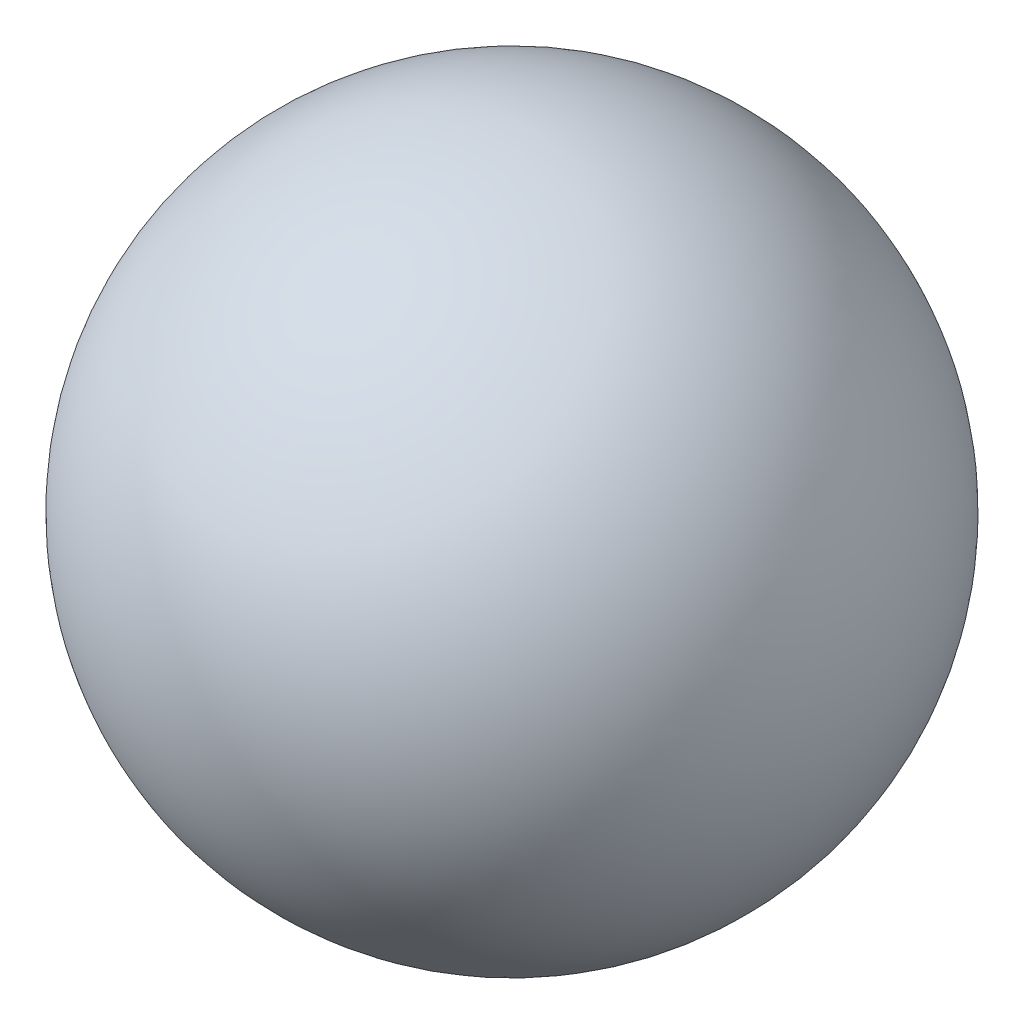
ISO-10303-21;
HEADER;
FILE_DESCRIPTION(('STEP AP214'),'2;1');
FILE_NAME('part.step','',(''),(''),'','','');
FILE_SCHEMA(('AUTOMOTIVE_DESIGN { 1 0 10303 214 1 1 1 1 }'));
ENDSEC;
DATA;
#1=APPLICATION_CONTEXT('core data for automotive mechanical design processes');
#2=APPLICATION_PROTOCOL_DEFINITION('international standard','automotive_design',2000,#1);
#3=PRODUCT_CONTEXT('',#1,'mechanical');
#4=PRODUCT('Part','Part','',(#3));
#5=PRODUCT_RELATED_PRODUCT_CATEGORY('part','',(#4));
#6=PRODUCT_DEFINITION_FORMATION('','',#4);
#7=PRODUCT_DEFINITION_CONTEXT('part definition',#1,'design');
#8=PRODUCT_DEFINITION('design','',#6,#7);
#9=PRODUCT_DEFINITION_SHAPE('','',#8);
#10=(LENGTH_UNIT() NAMED_UNIT(*) SI_UNIT(.MILLI.,.METRE.));
#11=(NAMED_UNIT(*) PLANE_ANGLE_UNIT() SI_UNIT($,.RADIAN.));
#12=(NAMED_UNIT(*) SI_UNIT($,.STERADIAN.) SOLID_ANGLE_UNIT());
#13=UNCERTAINTY_MEASURE_WITH_UNIT(LENGTH_MEASURE(1.E-05),#10,'distance_accuracy_value','');
#14=(GEOMETRIC_REPRESENTATION_CONTEXT(3) GLOBAL_UNCERTAINTY_ASSIGNED_CONTEXT((#13)) GLOBAL_UNIT_ASSIGNED_CONTEXT((#10,
#11,#12)) REPRESENTATION_CONTEXT('',''));
#15=CARTESIAN_POINT('',(0.,0.,0.));
#16=DIRECTION('',(0.,0.,1.));
#17=DIRECTION('',(1.,0.,0.));
#18=AXIS2_PLACEMENT_3D('',#15,#16,#17);
#19=CARTESIAN_POINT('',(0.,0.,0.));
#20=DIRECTION('',(0.,0.,-1.));
#21=DIRECTION('',(1.,0.,0.));
#22=AXIS2_PLACEMENT_3D('',#19,#20,#21);
#23=SPHERICAL_SURFACE('',#22,1250.);
#24=CARTESIAN_POINT('',(0.,0.,-1250.));
#25=VERTEX_POINT('',#24);
#26=VERTEX_LOOP('',#25);
#27=FACE_BOUND('',#26,.T.);
#28=ADVANCED_FACE('F33',(#27),#23,.T.);
#29=CLOSED_SHELL('',(#28));
#30=CARTESIAN_POINT('',(-3.37487741745857E-12,0.,358.190710175651));
#31=CARTESIAN_POINT('',(-0.144147467047814,0.,358.195591489924));
#32=CARTESIAN_POINT('',(-0.288474285001459,0.,358.200467539368));
#33=CARTESIAN_POINT('',(-0.432982244162883,0.,358.205338988255));
#34=B_SPLINE_CURVE_WITH_KNOTS('',3,(#30,#31,#32,#33),.UNSPECIFIED.,.F.,.F.,(4,4),
(0.997744754490691,1.),.UNSPECIFIED.);
#35=CARTESIAN_POINT('',(0.,0.,0.));
#36=DIRECTION('',(0.,0.,-1.));
#37=AXIS1_PLACEMENT('',#35,#36);
#38=SURFACE_OF_REVOLUTION('',#34,#37);
#39=CARTESIAN_POINT('',(0.,0.,358.205338988255));
#40=DIRECTION('',(0.,0.,-1.));
#41=DIRECTION('',(-1.,0.,0.));
#42=AXIS2_PLACEMENT_3D('',#39,#40,#41);
#43=CIRCLE('',#42,0.432982244162883);
#44=CARTESIAN_POINT('',(-0.432982244162883,0.,358.205338988255));
#45=VERTEX_POINT('',#44);
#46=EDGE_CURVE('E11',#45,#45,#43,.T.);
#47=ORIENTED_EDGE('',*,*,#46,.T.);
#48=EDGE_LOOP('',(#47));
#49=FACE_BOUND('',#48,.T.);
#50=CARTESIAN_POINT('',(-3.37487741745857E-12,0.,358.190710175651));
#51=VERTEX_POINT('',#50);
#52=VERTEX_LOOP('',#51);
#53=FACE_BOUND('',#52,.T.);
#54=ADVANCED_FACE('F43',(#49,#53),#38,.F.);
#55=CARTESIAN_POINT('',(-0.432982244162883,0.,358.205338988255));
#56=CARTESIAN_POINT('',(-18.4287864578607,0.,357.566021915606));
#57=CARTESIAN_POINT('',(-52.8169898188629,0.,355.964255518606));
#58=CARTESIAN_POINT('',(-112.213852110302,0.,342.392357972548));
#59=CARTESIAN_POINT('',(-147.10884668746,0.,326.311135078411));
#60=CARTESIAN_POINT('',(-167.78491966277,0.,316.479814659737));
#61=B_SPLINE_CURVE_WITH_KNOTS('',3,(#55,#56,#57,#58,#59,#60),.UNSPECIFIED.,.F.,.F.,(4,1,1,4),
(0.,0.282261472742738,0.641130736371371,1.),.UNSPECIFIED.);
#62=CARTESIAN_POINT('',(0.,0.,0.));
#63=DIRECTION('',(0.,0.,-1.));
#64=AXIS1_PLACEMENT('',#62,#63);
#65=SURFACE_OF_REVOLUTION('',#61,#64);
#66=CARTESIAN_POINT('',(0.,0.,316.479814659737));
#67=DIRECTION('',(0.,0.,-1.));
#68=DIRECTION('',(-1.,0.,0.));
#69=AXIS2_PLACEMENT_3D('',#66,#67,#68);
#70=CIRCLE('',#69,167.78491966277);
#71=CARTESIAN_POINT('',(-167.78491966277,0.,316.479814659737));
#72=VERTEX_POINT('',#71);
#73=EDGE_CURVE('E40',#72,#72,#70,.T.);
#74=ORIENTED_EDGE('',*,*,#73,.T.);
#75=EDGE_LOOP('',(#74));
#76=FACE_BOUND('',#75,.T.);
#77=ORIENTED_EDGE('',*,*,#46,.F.);
#78=EDGE_LOOP('',(#77));
#79=FACE_BOUND('',#78,.T.);
#80=ADVANCED_FACE('F45',(#76,#79),#65,.F.);
#81=CARTESIAN_POINT('',(-167.78491966277,0.,316.479814659737));
#82=CARTESIAN_POINT('',(-176.074070052281,0.,306.130242707188));
#83=CARTESIAN_POINT('',(-191.57699011548,0.,286.392684539802));
#84=CARTESIAN_POINT('',(-211.28094695326,0.,251.82634612407));
#85=CARTESIAN_POINT('',(-219.829782545101,0.,229.567936150873));
#86=CARTESIAN_POINT('',(-223.934351034346,0.,218.620913726708));
#87=B_SPLINE_CURVE_WITH_KNOTS('',3,(#81,#82,#83,#84,#85,#86),.UNSPECIFIED.,.F.,.F.,(4,1,1,4),
(0.,0.318900903542387,0.718824690263937,1.),.UNSPECIFIED.);
#88=CARTESIAN_POINT('',(0.,0.,0.));
#89=DIRECTION('',(0.,0.,-1.));
#90=AXIS1_PLACEMENT('',#88,#89);
#91=SURFACE_OF_REVOLUTION('',#87,#90);
#92=CARTESIAN_POINT('',(0.,0.,218.620913726708));
#93=DIRECTION('',(0.,0.,-1.));
#94=DIRECTION('',(-1.,0.,0.));
#95=AXIS2_PLACEMENT_3D('',#92,#93,#94);
#96=CIRCLE('',#95,223.934351034346);
#97=CARTESIAN_POINT('',(-223.934351034346,0.,218.620913726708));
#98=VERTEX_POINT('',#97);
#99=EDGE_CURVE('E103',#98,#98,#96,.T.);
#100=ORIENTED_EDGE('',*,*,#99,.T.);
#101=EDGE_LOOP('',(#100));
#102=FACE_BOUND('',#101,.T.);
#103=ORIENTED_EDGE('',*,*,#73,.F.);
#104=EDGE_LOOP('',(#103));
#105=FACE_BOUND('',#104,.T.);
#106=ADVANCED_FACE('F52',(#102,#105),#91,.F.);
#107=CARTESIAN_POINT('',(-223.934351034346,0.,218.620913726708));
#108=CARTESIAN_POINT('',(-222.693683000839,0.,203.038506830764));
#109=CARTESIAN_POINT('',(-220.212561604321,0.,178.593525458379));
#110=CARTESIAN_POINT('',(-207.270812094029,0.,143.995675682458));
#111=CARTESIAN_POINT('',(-190.385972929524,0.,118.278687230298));
#112=CARTESIAN_POINT('',(-176.923900916579,0.,108.405892655424));
#113=CARTESIAN_POINT('',(-169.999999999978,0.,103.506586026307));
#114=B_SPLINE_CURVE_WITH_KNOTS('',3,(#107,#108,#109,#110,#111,#112,#113),.UNSPECIFIED.,.F.,.F.,
(4,1,1,1,4),(0.,0.323150219490138,0.597473262303686,0.823700456788111,1.),.UNSPECIFIED.);
#115=CARTESIAN_POINT('',(0.,0.,0.));
#116=DIRECTION('',(0.,0.,-1.));
#117=AXIS1_PLACEMENT('',#115,#116);
#118=SURFACE_OF_REVOLUTION('',#114,#117);
#119=CARTESIAN_POINT('',(0.,0.,103.506586026307));
#120=DIRECTION('',(0.,0.,-1.));
#121=DIRECTION('',(-1.,0.,0.));
#122=AXIS2_PLACEMENT_3D('',#119,#120,#121);
#123=CIRCLE('',#122,169.999999999978);
#124=CARTESIAN_POINT('',(-169.999999999978,0.,103.506586026307));
#125=VERTEX_POINT('',#124);
#126=EDGE_CURVE('E101',#125,#125,#123,.T.);
#127=ORIENTED_EDGE('',*,*,#126,.T.);
#128=EDGE_LOOP('',(#127));
#129=FACE_BOUND('',#128,.T.);
#130=ORIENTED_EDGE('',*,*,#99,.F.);
#131=EDGE_LOOP('',(#130));
#132=FACE_BOUND('',#131,.T.);
#133=ADVANCED_FACE('F84',(#129,#132),#118,.F.);
#134=CARTESIAN_POINT('',(0.,0.,0.));
#135=DIRECTION('',(0.,0.,-1.));
#136=DIRECTION('',(-1.,0.,0.));
#137=AXIS2_PLACEMENT_3D('',#134,#135,#136);
#138=CYLINDRICAL_SURFACE('',#137,169.999999999978);
#139=CARTESIAN_POINT('',(0.,0.,0.));
#140=DIRECTION('',(0.,0.,-1.));
#141=DIRECTION('',(-1.,0.,0.));
#142=AXIS2_PLACEMENT_3D('',#139,#140,#141);
#143=CIRCLE('',#142,169.999999999978);
#144=CARTESIAN_POINT('',(-169.999999999978,0.,0.));
#145=VERTEX_POINT('',#144);
#146=EDGE_CURVE('E100',#145,#145,#143,.T.);
#147=ORIENTED_EDGE('',*,*,#146,.T.);
#148=EDGE_LOOP('',(#147));
#149=FACE_BOUND('',#148,.T.);
#150=ORIENTED_EDGE('',*,*,#126,.F.);
#151=EDGE_LOOP('',(#150));
#152=FACE_BOUND('',#151,.T.);
#153=ADVANCED_FACE('F88',(#149,#152),#138,.F.);
#154=CARTESIAN_POINT('',(2.19824158875781E-11,0.,0.));
#155=DIRECTION('',(0.,0.,-1.));
#156=DIRECTION('',(-1.,0.,0.));
#157=AXIS2_PLACEMENT_3D('',#154,#155,#156);
#158=SPHERICAL_SURFACE('',#157,170.);
#159=ORIENTED_EDGE('',*,*,#146,.F.);
#160=EDGE_LOOP('',(#159));
#161=FACE_BOUND('',#160,.T.);
#162=ADVANCED_FACE('F92',(#161),#158,.F.);
#163=CLOSED_SHELL('',(#54,#80,#106,#133,#153,#162));
#164=ORIENTED_CLOSED_SHELL('',*,#163,.T.);
#165=BREP_WITH_VOIDS('B2',#29,(#164));
#166=ADVANCED_BREP_SHAPE_REPRESENTATION('',(#18,#165),#14);
#167=SHAPE_DEFINITION_REPRESENTATION(#9,#166);
ENDSEC;
END-ISO-10303-21;
